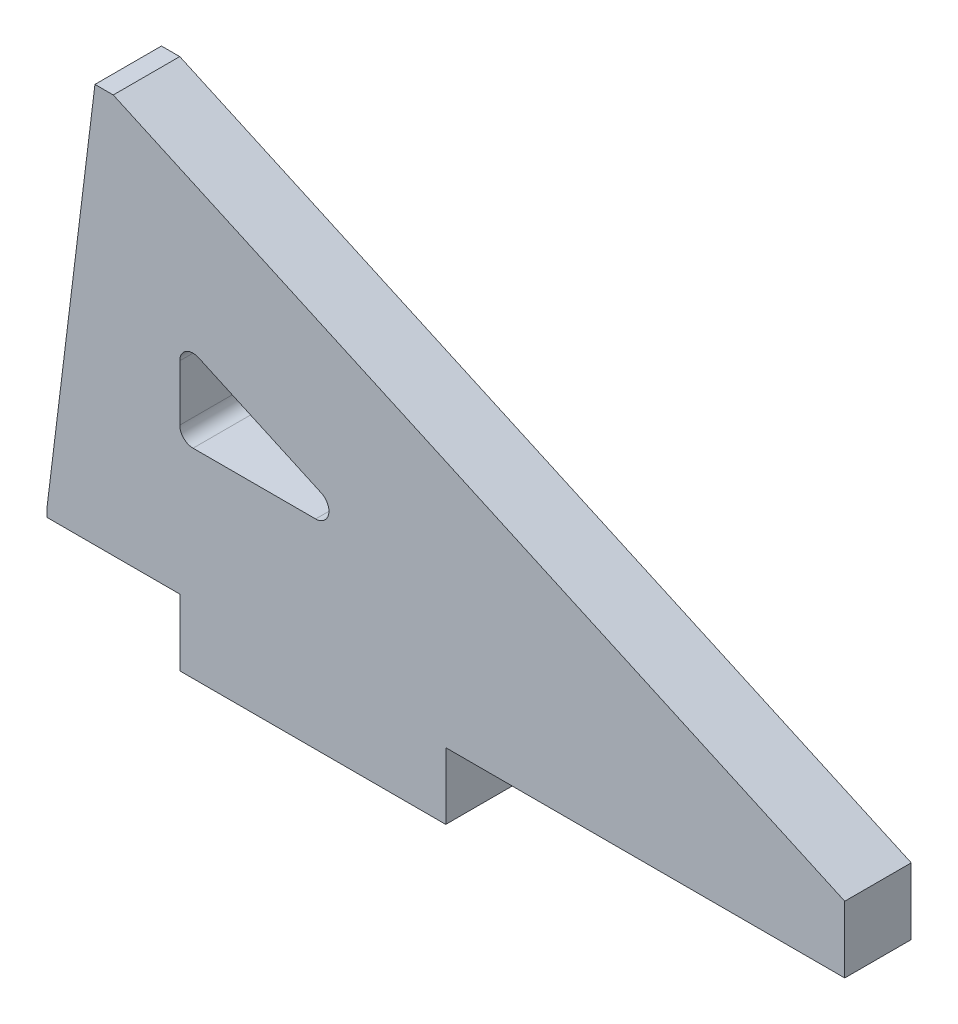
ISO-10303-21;
HEADER;
FILE_DESCRIPTION(('STEP AP214'),'2;1');
FILE_NAME('part.step','',(''),(''),'','','');
FILE_SCHEMA(('AUTOMOTIVE_DESIGN { 1 0 10303 214 1 1 1 1 }'));
ENDSEC;
DATA;
#1=APPLICATION_CONTEXT('core data for automotive mechanical design processes');
#2=APPLICATION_PROTOCOL_DEFINITION('international standard','automotive_design',2000,#1);
#3=PRODUCT_CONTEXT('',#1,'mechanical');
#4=PRODUCT('Part','Part','',(#3));
#5=PRODUCT_RELATED_PRODUCT_CATEGORY('part','',(#4));
#6=PRODUCT_DEFINITION_FORMATION('','',#4);
#7=PRODUCT_DEFINITION_CONTEXT('part definition',#1,'design');
#8=PRODUCT_DEFINITION('design','',#6,#7);
#9=PRODUCT_DEFINITION_SHAPE('','',#8);
#10=(LENGTH_UNIT() NAMED_UNIT(*) SI_UNIT(.MILLI.,.METRE.));
#11=(NAMED_UNIT(*) PLANE_ANGLE_UNIT() SI_UNIT($,.RADIAN.));
#12=(NAMED_UNIT(*) SI_UNIT($,.STERADIAN.) SOLID_ANGLE_UNIT());
#13=UNCERTAINTY_MEASURE_WITH_UNIT(LENGTH_MEASURE(1.E-05),#10,'distance_accuracy_value','');
#14=(GEOMETRIC_REPRESENTATION_CONTEXT(3) GLOBAL_UNCERTAINTY_ASSIGNED_CONTEXT((#13)) GLOBAL_UNIT_ASSIGNED_CONTEXT((#10,
#11,#12)) REPRESENTATION_CONTEXT('',''));
#15=CARTESIAN_POINT('',(0.,0.,0.));
#16=DIRECTION('',(0.,0.,1.));
#17=DIRECTION('',(1.,0.,0.));
#18=AXIS2_PLACEMENT_3D('',#15,#16,#17);
#19=CARTESIAN_POINT('',(0.,0.,6.35));
#20=DIRECTION('',(0.,0.,-1.));
#21=DIRECTION('',(-1.,0.,0.));
#22=AXIS2_PLACEMENT_3D('',#19,#20,#21);
#23=PLANE('',#22);
#24=DIRECTION('',(-1.,0.,0.));
#25=VECTOR('',#24,1.);
#26=CARTESIAN_POINT('',(-12.7,44.45,6.35));
#27=LINE('',#26,#25);
#28=CARTESIAN_POINT('',(-6.35,44.45,6.35));
#29=VERTEX_POINT('',#28);
#30=CARTESIAN_POINT('',(-8.09810822959274,44.45,6.35));
#31=VERTEX_POINT('',#30);
#32=EDGE_CURVE('E228',#29,#31,#27,.T.);
#33=ORIENTED_EDGE('',*,*,#32,.T.);
#34=DIRECTION('',(0.121869343405138,0.992546151641323,0.));
#35=VECTOR('',#34,1.);
#36=CARTESIAN_POINT('',(-8.09810822959274,44.45,6.35));
#37=LINE('',#36,#35);
#38=CARTESIAN_POINT('',(-12.7,6.97059919775531,6.35));
#39=VERTEX_POINT('',#38);
#40=EDGE_CURVE('E153',#39,#31,#37,.T.);
#41=ORIENTED_EDGE('',*,*,#40,.F.);
#42=DIRECTION('',(0.,-1.,0.));
#43=VECTOR('',#42,1.);
#44=CARTESIAN_POINT('',(-12.7,6.34999999999999,6.35));
#45=LINE('',#44,#43);
#46=CARTESIAN_POINT('',(-12.7,6.34999999999999,6.35));
#47=VERTEX_POINT('',#46);
#48=EDGE_CURVE('E226',#39,#47,#45,.T.);
#49=ORIENTED_EDGE('',*,*,#48,.T.);
#50=DIRECTION('',(1.,0.,0.));
#51=VECTOR('',#50,1.);
#52=CARTESIAN_POINT('',(0.,6.35,6.35));
#53=LINE('',#52,#51);
#54=CARTESIAN_POINT('',(0.,6.35,6.35));
#55=VERTEX_POINT('',#54);
#56=EDGE_CURVE('E224',#47,#55,#53,.T.);
#57=ORIENTED_EDGE('',*,*,#56,.T.);
#58=DIRECTION('',(0.,-1.,0.));
#59=VECTOR('',#58,1.);
#60=CARTESIAN_POINT('',(0.,0.,6.35));
#61=LINE('',#60,#59);
#62=CARTESIAN_POINT('',(0.,0.,6.35));
#63=VERTEX_POINT('',#62);
#64=EDGE_CURVE('E191',#55,#63,#61,.T.);
#65=ORIENTED_EDGE('',*,*,#64,.T.);
#66=DIRECTION('',(1.,0.,0.));
#67=VECTOR('',#66,1.);
#68=CARTESIAN_POINT('',(25.4,0.,6.35));
#69=LINE('',#68,#67);
#70=CARTESIAN_POINT('',(25.4,0.,6.35));
#71=VERTEX_POINT('',#70);
#72=EDGE_CURVE('E186',#63,#71,#69,.T.);
#73=ORIENTED_EDGE('',*,*,#72,.T.);
#74=DIRECTION('',(0.,1.,0.));
#75=VECTOR('',#74,1.);
#76=CARTESIAN_POINT('',(25.4,6.35,6.35));
#77=LINE('',#76,#75);
#78=CARTESIAN_POINT('',(25.4,6.35,6.35));
#79=VERTEX_POINT('',#78);
#80=EDGE_CURVE('E235',#71,#79,#77,.T.);
#81=ORIENTED_EDGE('',*,*,#80,.T.);
#82=DIRECTION('',(1.,0.,0.));
#83=VECTOR('',#82,1.);
#84=CARTESIAN_POINT('',(63.5,6.35,6.35));
#85=LINE('',#84,#83);
#86=CARTESIAN_POINT('',(63.5,6.35,6.35));
#87=VERTEX_POINT('',#86);
#88=EDGE_CURVE('E211',#79,#87,#85,.T.);
#89=ORIENTED_EDGE('',*,*,#88,.T.);
#90=DIRECTION('',(0.,1.,0.));
#91=VECTOR('',#90,1.);
#92=CARTESIAN_POINT('',(63.5,12.7,6.35));
#93=LINE('',#92,#91);
#94=CARTESIAN_POINT('',(63.5,12.7,6.35));
#95=VERTEX_POINT('',#94);
#96=EDGE_CURVE('E232',#87,#95,#93,.T.);
#97=ORIENTED_EDGE('',*,*,#96,.T.);
#98=DIRECTION('',(-0.910366477462605,0.413802944301184,0.));
#99=VECTOR('',#98,1.);
#100=CARTESIAN_POINT('',(-6.35,44.45,6.35));
#101=LINE('',#100,#99);
#102=EDGE_CURVE('E230',#95,#29,#101,.T.);
#103=ORIENTED_EDGE('',*,*,#102,.T.);
#104=EDGE_LOOP('',(#33,#41,#49,#57,#65,#73,#81,#89,#97,#103));
#105=FACE_BOUND('',#104,.T.);
#106=CARTESIAN_POINT('',(1.27,20.32,6.35));
#107=DIRECTION('',(0.,0.,1.));
#108=DIRECTION('',(1.,0.,0.));
#109=AXIS2_PLACEMENT_3D('',#106,#107,#108);
#110=CIRCLE('',#109,1.27);
#111=CARTESIAN_POINT('',(0.,20.32,6.35));
#112=VERTEX_POINT('',#111);
#113=CARTESIAN_POINT('',(1.27000000000001,19.05,6.35));
#114=VERTEX_POINT('',#113);
#115=EDGE_CURVE('E255',#112,#114,#110,.T.);
#116=ORIENTED_EDGE('',*,*,#115,.F.);
#117=DIRECTION('',(0.,-1.,0.));
#118=VECTOR('',#117,1.);
#119=CARTESIAN_POINT('',(0.,25.6408952498985,6.35));
#120=LINE('',#119,#118);
#121=CARTESIAN_POINT('',(0.,25.6408952498985,6.35));
#122=VERTEX_POINT('',#121);
#123=EDGE_CURVE('E251',#122,#112,#120,.T.);
#124=ORIENTED_EDGE('',*,*,#123,.F.);
#125=CARTESIAN_POINT('',(1.27,25.6408952498985,6.35));
#126=DIRECTION('',(0.,0.,1.));
#127=DIRECTION('',(1.,0.,0.));
#128=AXIS2_PLACEMENT_3D('',#125,#126,#127);
#129=CIRCLE('',#128,1.27);
#130=CARTESIAN_POINT('',(1.79552973926252,26.797060676276,6.35));
#131=VERTEX_POINT('',#130);
#132=EDGE_CURVE('E271',#131,#122,#129,.T.);
#133=ORIENTED_EDGE('',*,*,#132,.F.);
#134=DIRECTION('',(-0.910366477462605,0.413802944301184,0.));
#135=VECTOR('',#134,1.);
#136=CARTESIAN_POINT('',(13.5014992890392,21.4761654263775,6.35));
#137=LINE('',#136,#135);
#138=CARTESIAN_POINT('',(13.5014992890392,21.4761654263775,6.35));
#139=VERTEX_POINT('',#138);
#140=EDGE_CURVE('E273',#139,#131,#137,.T.);
#141=ORIENTED_EDGE('',*,*,#140,.F.);
#142=CARTESIAN_POINT('',(12.9759695497768,20.32,6.35));
#143=DIRECTION('',(0.,0.,1.));
#144=DIRECTION('',(1.,0.,0.));
#145=AXIS2_PLACEMENT_3D('',#142,#143,#144);
#146=CIRCLE('',#145,1.27);
#147=CARTESIAN_POINT('',(12.9759695497767,19.05,6.35));
#148=VERTEX_POINT('',#147);
#149=EDGE_CURVE('E275',#148,#139,#146,.T.);
#150=ORIENTED_EDGE('',*,*,#149,.F.);
#151=DIRECTION('',(1.,0.,0.));
#152=VECTOR('',#151,1.);
#153=CARTESIAN_POINT('',(1.27000000000001,19.05,6.35));
#154=LINE('',#153,#152);
#155=EDGE_CURVE('E277',#114,#148,#154,.T.);
#156=ORIENTED_EDGE('',*,*,#155,.F.);
#157=EDGE_LOOP('',(#116,#124,#133,#141,#150,#156));
#158=FACE_BOUND('',#157,.T.);
#159=ADVANCED_FACE('F39',(#105,#158),#23,.F.);
#160=CARTESIAN_POINT('',(0.,0.,0.));
#161=DIRECTION('',(0.,0.,-1.));
#162=DIRECTION('',(-1.,0.,0.));
#163=AXIS2_PLACEMENT_3D('',#160,#161,#162);
#164=PLANE('',#163);
#165=DIRECTION('',(0.121869343405138,0.992546151641323,0.));
#166=VECTOR('',#165,1.);
#167=CARTESIAN_POINT('',(-8.09810822959274,44.45,0.));
#168=LINE('',#167,#166);
#169=CARTESIAN_POINT('',(-12.7,6.97059919775531,0.));
#170=VERTEX_POINT('',#169);
#171=CARTESIAN_POINT('',(-8.09810822959274,44.45,0.));
#172=VERTEX_POINT('',#171);
#173=EDGE_CURVE('E54',#170,#172,#168,.T.);
#174=ORIENTED_EDGE('',*,*,#173,.T.);
#175=DIRECTION('',(-1.,0.,0.));
#176=VECTOR('',#175,1.);
#177=CARTESIAN_POINT('',(-12.7,44.45,0.));
#178=LINE('',#177,#176);
#179=CARTESIAN_POINT('',(-6.35,44.45,0.));
#180=VERTEX_POINT('',#179);
#181=EDGE_CURVE('E167',#180,#172,#178,.T.);
#182=ORIENTED_EDGE('',*,*,#181,.F.);
#183=DIRECTION('',(-0.910366477462605,0.413802944301184,0.));
#184=VECTOR('',#183,1.);
#185=CARTESIAN_POINT('',(-6.35,44.45,0.));
#186=LINE('',#185,#184);
#187=CARTESIAN_POINT('',(63.5,12.7,0.));
#188=VERTEX_POINT('',#187);
#189=EDGE_CURVE('E175',#188,#180,#186,.T.);
#190=ORIENTED_EDGE('',*,*,#189,.F.);
#191=DIRECTION('',(0.,1.,0.));
#192=VECTOR('',#191,1.);
#193=CARTESIAN_POINT('',(63.5,12.7,0.));
#194=LINE('',#193,#192);
#195=CARTESIAN_POINT('',(63.5,6.35,0.));
#196=VERTEX_POINT('',#195);
#197=EDGE_CURVE('E179',#196,#188,#194,.T.);
#198=ORIENTED_EDGE('',*,*,#197,.F.);
#199=DIRECTION('',(1.,0.,0.));
#200=VECTOR('',#199,1.);
#201=CARTESIAN_POINT('',(63.5,6.35,0.));
#202=LINE('',#201,#200);
#203=CARTESIAN_POINT('',(25.4,6.35,0.));
#204=VERTEX_POINT('',#203);
#205=EDGE_CURVE('E210',#204,#196,#202,.T.);
#206=ORIENTED_EDGE('',*,*,#205,.F.);
#207=DIRECTION('',(0.,1.,0.));
#208=VECTOR('',#207,1.);
#209=CARTESIAN_POINT('',(25.4,6.35,0.));
#210=LINE('',#209,#208);
#211=CARTESIAN_POINT('',(25.4,0.,0.));
#212=VERTEX_POINT('',#211);
#213=EDGE_CURVE('E215',#212,#204,#210,.T.);
#214=ORIENTED_EDGE('',*,*,#213,.F.);
#215=DIRECTION('',(1.,0.,0.));
#216=VECTOR('',#215,1.);
#217=CARTESIAN_POINT('',(25.4,0.,0.));
#218=LINE('',#217,#216);
#219=CARTESIAN_POINT('',(0.,0.,0.));
#220=VERTEX_POINT('',#219);
#221=EDGE_CURVE('E217',#220,#212,#218,.T.);
#222=ORIENTED_EDGE('',*,*,#221,.F.);
#223=DIRECTION('',(0.,-1.,0.));
#224=VECTOR('',#223,1.);
#225=CARTESIAN_POINT('',(0.,0.,0.));
#226=LINE('',#225,#224);
#227=CARTESIAN_POINT('',(0.,6.35,0.));
#228=VERTEX_POINT('',#227);
#229=EDGE_CURVE('E184',#228,#220,#226,.T.);
#230=ORIENTED_EDGE('',*,*,#229,.F.);
#231=DIRECTION('',(1.,0.,0.));
#232=VECTOR('',#231,1.);
#233=CARTESIAN_POINT('',(0.,6.35,0.));
#234=LINE('',#233,#232);
#235=CARTESIAN_POINT('',(-12.7,6.34999999999999,0.));
#236=VERTEX_POINT('',#235);
#237=EDGE_CURVE('E177',#236,#228,#234,.T.);
#238=ORIENTED_EDGE('',*,*,#237,.F.);
#239=DIRECTION('',(0.,-1.,0.));
#240=VECTOR('',#239,1.);
#241=CARTESIAN_POINT('',(-12.7,6.34999999999999,0.));
#242=LINE('',#241,#240);
#243=EDGE_CURVE('E169',#170,#236,#242,.T.);
#244=ORIENTED_EDGE('',*,*,#243,.F.);
#245=EDGE_LOOP('',(#174,#182,#190,#198,#206,#214,#222,#230,#238,#244));
#246=FACE_BOUND('',#245,.T.);
#247=DIRECTION('',(0.,-1.,0.));
#248=VECTOR('',#247,1.);
#249=CARTESIAN_POINT('',(0.,25.6408952498985,0.));
#250=LINE('',#249,#248);
#251=CARTESIAN_POINT('',(0.,25.6408952498985,0.));
#252=VERTEX_POINT('',#251);
#253=CARTESIAN_POINT('',(0.,20.32,0.));
#254=VERTEX_POINT('',#253);
#255=EDGE_CURVE('E252',#252,#254,#250,.T.);
#256=ORIENTED_EDGE('',*,*,#255,.T.);
#257=CARTESIAN_POINT('',(1.27,20.32,0.));
#258=DIRECTION('',(0.,0.,1.));
#259=DIRECTION('',(1.,0.,0.));
#260=AXIS2_PLACEMENT_3D('',#257,#258,#259);
#261=CIRCLE('',#260,1.27);
#262=CARTESIAN_POINT('',(1.27000000000001,19.05,0.));
#263=VERTEX_POINT('',#262);
#264=EDGE_CURVE('E158',#254,#263,#261,.T.);
#265=ORIENTED_EDGE('',*,*,#264,.T.);
#266=DIRECTION('',(1.,0.,0.));
#267=VECTOR('',#266,1.);
#268=CARTESIAN_POINT('',(1.27000000000001,19.05,0.));
#269=LINE('',#268,#267);
#270=CARTESIAN_POINT('',(12.9759695497767,19.05,0.));
#271=VERTEX_POINT('',#270);
#272=EDGE_CURVE('E265',#263,#271,#269,.T.);
#273=ORIENTED_EDGE('',*,*,#272,.T.);
#274=CARTESIAN_POINT('',(12.9759695497768,20.32,0.));
#275=DIRECTION('',(0.,0.,1.));
#276=DIRECTION('',(1.,0.,0.));
#277=AXIS2_PLACEMENT_3D('',#274,#275,#276);
#278=CIRCLE('',#277,1.27);
#279=CARTESIAN_POINT('',(13.5014992890392,21.4761654263775,0.));
#280=VERTEX_POINT('',#279);
#281=EDGE_CURVE('E262',#271,#280,#278,.T.);
#282=ORIENTED_EDGE('',*,*,#281,.T.);
#283=DIRECTION('',(-0.910366477462605,0.413802944301184,0.));
#284=VECTOR('',#283,1.);
#285=CARTESIAN_POINT('',(13.5014992890392,21.4761654263775,0.));
#286=LINE('',#285,#284);
#287=CARTESIAN_POINT('',(1.79552973926252,26.797060676276,0.));
#288=VERTEX_POINT('',#287);
#289=EDGE_CURVE('E259',#280,#288,#286,.T.);
#290=ORIENTED_EDGE('',*,*,#289,.T.);
#291=CARTESIAN_POINT('',(1.27,25.6408952498985,0.));
#292=DIRECTION('',(0.,0.,1.));
#293=DIRECTION('',(1.,0.,0.));
#294=AXIS2_PLACEMENT_3D('',#291,#292,#293);
#295=CIRCLE('',#294,1.27);
#296=EDGE_CURVE('E256',#288,#252,#295,.T.);
#297=ORIENTED_EDGE('',*,*,#296,.T.);
#298=EDGE_LOOP('',(#256,#265,#273,#282,#290,#297));
#299=FACE_BOUND('',#298,.T.);
#300=ADVANCED_FACE('F164',(#246,#299),#164,.T.);
#301=CARTESIAN_POINT('',(25.4,0.,6.35));
#302=DIRECTION('',(0.,1.,0.));
#303=DIRECTION('',(-1.,0.,0.));
#304=AXIS2_PLACEMENT_3D('',#301,#302,#303);
#305=PLANE('',#304);
#306=ORIENTED_EDGE('',*,*,#221,.T.);
#307=DIRECTION('',(0.,0.,-1.));
#308=VECTOR('',#307,1.);
#309=CARTESIAN_POINT('',(25.4,0.,6.35));
#310=LINE('',#309,#308);
#311=EDGE_CURVE('E11',#71,#212,#310,.T.);
#312=ORIENTED_EDGE('',*,*,#311,.F.);
#313=ORIENTED_EDGE('',*,*,#72,.F.);
#314=DIRECTION('',(0.,0.,-1.));
#315=VECTOR('',#314,1.);
#316=CARTESIAN_POINT('',(0.,0.,6.35));
#317=LINE('',#316,#315);
#318=EDGE_CURVE('E187',#63,#220,#317,.T.);
#319=ORIENTED_EDGE('',*,*,#318,.T.);
#320=EDGE_LOOP('',(#306,#312,#313,#319));
#321=FACE_BOUND('',#320,.T.);
#322=ADVANCED_FACE('F41',(#321),#305,.F.);
#323=CARTESIAN_POINT('',(25.4,6.35,6.35));
#324=DIRECTION('',(-1.,0.,0.));
#325=DIRECTION('',(0.,0.,1.));
#326=AXIS2_PLACEMENT_3D('',#323,#324,#325);
#327=PLANE('',#326);
#328=ORIENTED_EDGE('',*,*,#213,.T.);
#329=DIRECTION('',(0.,0.,-1.));
#330=VECTOR('',#329,1.);
#331=CARTESIAN_POINT('',(25.4,6.35,6.35));
#332=LINE('',#331,#330);
#333=EDGE_CURVE('E47',#79,#204,#332,.T.);
#334=ORIENTED_EDGE('',*,*,#333,.F.);
#335=ORIENTED_EDGE('',*,*,#80,.F.);
#336=ORIENTED_EDGE('',*,*,#311,.T.);
#337=EDGE_LOOP('',(#328,#334,#335,#336));
#338=FACE_BOUND('',#337,.T.);
#339=ADVANCED_FACE('F299',(#338),#327,.F.);
#340=CARTESIAN_POINT('',(63.5,6.35,6.35));
#341=DIRECTION('',(0.,1.,0.));
#342=DIRECTION('',(-1.,0.,0.));
#343=AXIS2_PLACEMENT_3D('',#340,#341,#342);
#344=PLANE('',#343);
#345=ORIENTED_EDGE('',*,*,#205,.T.);
#346=DIRECTION('',(0.,0.,-1.));
#347=VECTOR('',#346,1.);
#348=CARTESIAN_POINT('',(63.5,6.35,6.35));
#349=LINE('',#348,#347);
#350=EDGE_CURVE('E201',#87,#196,#349,.T.);
#351=ORIENTED_EDGE('',*,*,#350,.F.);
#352=ORIENTED_EDGE('',*,*,#88,.F.);
#353=ORIENTED_EDGE('',*,*,#333,.T.);
#354=EDGE_LOOP('',(#345,#351,#352,#353));
#355=FACE_BOUND('',#354,.T.);
#356=ADVANCED_FACE('F208',(#355),#344,.F.);
#357=CARTESIAN_POINT('',(63.5,12.7,6.35));
#358=DIRECTION('',(-1.,0.,0.));
#359=DIRECTION('',(0.,0.,1.));
#360=AXIS2_PLACEMENT_3D('',#357,#358,#359);
#361=PLANE('',#360);
#362=ORIENTED_EDGE('',*,*,#197,.T.);
#363=DIRECTION('',(0.,0.,-1.));
#364=VECTOR('',#363,1.);
#365=CARTESIAN_POINT('',(63.5,12.7,6.35));
#366=LINE('',#365,#364);
#367=EDGE_CURVE('E198',#95,#188,#366,.T.);
#368=ORIENTED_EDGE('',*,*,#367,.F.);
#369=ORIENTED_EDGE('',*,*,#96,.F.);
#370=ORIENTED_EDGE('',*,*,#350,.T.);
#371=EDGE_LOOP('',(#362,#368,#369,#370));
#372=FACE_BOUND('',#371,.T.);
#373=ADVANCED_FACE('F303',(#372),#361,.F.);
#374=CARTESIAN_POINT('',(-6.35,44.45,6.35));
#375=DIRECTION('',(-0.413802944301184,-0.910366477462605,0.));
#376=DIRECTION('',(0.910366477462605,-0.413802944301184,0.));
#377=AXIS2_PLACEMENT_3D('',#374,#375,#376);
#378=PLANE('',#377);
#379=ORIENTED_EDGE('',*,*,#189,.T.);
#380=DIRECTION('',(0.,0.,-1.));
#381=VECTOR('',#380,1.);
#382=CARTESIAN_POINT('',(-6.35,44.45,6.35));
#383=LINE('',#382,#381);
#384=EDGE_CURVE('E174',#29,#180,#383,.T.);
#385=ORIENTED_EDGE('',*,*,#384,.F.);
#386=ORIENTED_EDGE('',*,*,#102,.F.);
#387=ORIENTED_EDGE('',*,*,#367,.T.);
#388=EDGE_LOOP('',(#379,#385,#386,#387));
#389=FACE_BOUND('',#388,.T.);
#390=ADVANCED_FACE('F306',(#389),#378,.F.);
#391=CARTESIAN_POINT('',(-12.7,44.45,6.35));
#392=DIRECTION('',(0.,-1.,0.));
#393=DIRECTION('',(0.,0.,-1.));
#394=AXIS2_PLACEMENT_3D('',#391,#392,#393);
#395=PLANE('',#394);
#396=ORIENTED_EDGE('',*,*,#181,.T.);
#397=DIRECTION('',(0.,0.,1.));
#398=VECTOR('',#397,1.);
#399=CARTESIAN_POINT('',(-8.09810822959274,44.45,0.));
#400=LINE('',#399,#398);
#401=EDGE_CURVE('E150',#172,#31,#400,.T.);
#402=ORIENTED_EDGE('',*,*,#401,.T.);
#403=ORIENTED_EDGE('',*,*,#32,.F.);
#404=ORIENTED_EDGE('',*,*,#384,.T.);
#405=EDGE_LOOP('',(#396,#402,#403,#404));
#406=FACE_BOUND('',#405,.T.);
#407=ADVANCED_FACE('F172',(#406),#395,.F.);
#408=CARTESIAN_POINT('',(-12.7,6.34999999999999,6.35));
#409=DIRECTION('',(1.,0.,0.));
#410=DIRECTION('',(0.,0.,-1.));
#411=AXIS2_PLACEMENT_3D('',#408,#409,#410);
#412=PLANE('',#411);
#413=ORIENTED_EDGE('',*,*,#48,.F.);
#414=DIRECTION('',(0.,0.,1.));
#415=VECTOR('',#414,1.);
#416=CARTESIAN_POINT('',(-12.7,6.97059919775531,0.));
#417=LINE('',#416,#415);
#418=EDGE_CURVE('E159',#170,#39,#417,.T.);
#419=ORIENTED_EDGE('',*,*,#418,.F.);
#420=ORIENTED_EDGE('',*,*,#243,.T.);
#421=DIRECTION('',(0.,0.,-1.));
#422=VECTOR('',#421,1.);
#423=CARTESIAN_POINT('',(-12.7,6.34999999999999,6.35));
#424=LINE('',#423,#422);
#425=EDGE_CURVE('E194',#47,#236,#424,.T.);
#426=ORIENTED_EDGE('',*,*,#425,.F.);
#427=EDGE_LOOP('',(#413,#419,#420,#426));
#428=FACE_BOUND('',#427,.T.);
#429=ADVANCED_FACE('F286',(#428),#412,.F.);
#430=CARTESIAN_POINT('',(0.,6.35,6.35));
#431=DIRECTION('',(0.,1.,0.));
#432=DIRECTION('',(-1.,0.,0.));
#433=AXIS2_PLACEMENT_3D('',#430,#431,#432);
#434=PLANE('',#433);
#435=ORIENTED_EDGE('',*,*,#237,.T.);
#436=DIRECTION('',(0.,0.,-1.));
#437=VECTOR('',#436,1.);
#438=CARTESIAN_POINT('',(0.,6.35,6.35));
#439=LINE('',#438,#437);
#440=EDGE_CURVE('E190',#55,#228,#439,.T.);
#441=ORIENTED_EDGE('',*,*,#440,.F.);
#442=ORIENTED_EDGE('',*,*,#56,.F.);
#443=ORIENTED_EDGE('',*,*,#425,.T.);
#444=EDGE_LOOP('',(#435,#441,#442,#443));
#445=FACE_BOUND('',#444,.T.);
#446=ADVANCED_FACE('F290',(#445),#434,.F.);
#447=CARTESIAN_POINT('',(0.,0.,6.35));
#448=DIRECTION('',(1.,0.,0.));
#449=DIRECTION('',(0.,0.,-1.));
#450=AXIS2_PLACEMENT_3D('',#447,#448,#449);
#451=PLANE('',#450);
#452=ORIENTED_EDGE('',*,*,#229,.T.);
#453=ORIENTED_EDGE('',*,*,#318,.F.);
#454=ORIENTED_EDGE('',*,*,#64,.F.);
#455=ORIENTED_EDGE('',*,*,#440,.T.);
#456=EDGE_LOOP('',(#452,#453,#454,#455));
#457=FACE_BOUND('',#456,.T.);
#458=ADVANCED_FACE('F296',(#457),#451,.F.);
#459=CARTESIAN_POINT('',(1.27,20.32,6.35));
#460=DIRECTION('',(0.,0.,-1.));
#461=DIRECTION('',(-1.,0.,0.));
#462=AXIS2_PLACEMENT_3D('',#459,#460,#461);
#463=CYLINDRICAL_SURFACE('',#462,1.27);
#464=ORIENTED_EDGE('',*,*,#264,.F.);
#465=DIRECTION('',(0.,0.,-1.));
#466=VECTOR('',#465,1.);
#467=CARTESIAN_POINT('',(0.,20.32,6.35));
#468=LINE('',#467,#466);
#469=EDGE_CURVE('E248',#112,#254,#468,.T.);
#470=ORIENTED_EDGE('',*,*,#469,.F.);
#471=ORIENTED_EDGE('',*,*,#115,.T.);
#472=DIRECTION('',(0.,0.,-1.));
#473=VECTOR('',#472,1.);
#474=CARTESIAN_POINT('',(1.27000000000001,19.05,6.35));
#475=LINE('',#474,#473);
#476=EDGE_CURVE('E222',#114,#263,#475,.T.);
#477=ORIENTED_EDGE('',*,*,#476,.T.);
#478=EDGE_LOOP('',(#464,#470,#471,#477));
#479=FACE_BOUND('',#478,.T.);
#480=ADVANCED_FACE('F324',(#479),#463,.F.);
#481=CARTESIAN_POINT('',(1.27000000000001,19.05,6.35));
#482=DIRECTION('',(0.,1.,0.));
#483=DIRECTION('',(0.,0.,1.));
#484=AXIS2_PLACEMENT_3D('',#481,#482,#483);
#485=PLANE('',#484);
#486=ORIENTED_EDGE('',*,*,#272,.F.);
#487=ORIENTED_EDGE('',*,*,#476,.F.);
#488=ORIENTED_EDGE('',*,*,#155,.T.);
#489=DIRECTION('',(0.,0.,-1.));
#490=VECTOR('',#489,1.);
#491=CARTESIAN_POINT('',(12.9759695497767,19.05,6.35));
#492=LINE('',#491,#490);
#493=EDGE_CURVE('E241',#148,#271,#492,.T.);
#494=ORIENTED_EDGE('',*,*,#493,.T.);
#495=EDGE_LOOP('',(#486,#487,#488,#494));
#496=FACE_BOUND('',#495,.T.);
#497=ADVANCED_FACE('F382',(#496),#485,.T.);
#498=CARTESIAN_POINT('',(12.9759695497768,20.32,6.35));
#499=DIRECTION('',(0.,0.,-1.));
#500=DIRECTION('',(-1.,0.,0.));
#501=AXIS2_PLACEMENT_3D('',#498,#499,#500);
#502=CYLINDRICAL_SURFACE('',#501,1.27);
#503=ORIENTED_EDGE('',*,*,#281,.F.);
#504=ORIENTED_EDGE('',*,*,#493,.F.);
#505=ORIENTED_EDGE('',*,*,#149,.T.);
#506=DIRECTION('',(0.,0.,-1.));
#507=VECTOR('',#506,1.);
#508=CARTESIAN_POINT('',(13.5014992890392,21.4761654263775,6.35));
#509=LINE('',#508,#507);
#510=EDGE_CURVE('E243',#139,#280,#509,.T.);
#511=ORIENTED_EDGE('',*,*,#510,.T.);
#512=EDGE_LOOP('',(#503,#504,#505,#511));
#513=FACE_BOUND('',#512,.T.);
#514=ADVANCED_FACE('F372',(#513),#502,.F.);
#515=CARTESIAN_POINT('',(13.5014992890392,21.4761654263775,6.35));
#516=DIRECTION('',(-0.413802944301184,-0.910366477462605,0.));
#517=DIRECTION('',(0.910366477462605,-0.413802944301184,0.));
#518=AXIS2_PLACEMENT_3D('',#515,#516,#517);
#519=PLANE('',#518);
#520=ORIENTED_EDGE('',*,*,#289,.F.);
#521=ORIENTED_EDGE('',*,*,#510,.F.);
#522=ORIENTED_EDGE('',*,*,#140,.T.);
#523=DIRECTION('',(0.,0.,-1.));
#524=VECTOR('',#523,1.);
#525=CARTESIAN_POINT('',(1.79552973926252,26.797060676276,6.35));
#526=LINE('',#525,#524);
#527=EDGE_CURVE('E245',#131,#288,#526,.T.);
#528=ORIENTED_EDGE('',*,*,#527,.T.);
#529=EDGE_LOOP('',(#520,#521,#522,#528));
#530=FACE_BOUND('',#529,.T.);
#531=ADVANCED_FACE('F362',(#530),#519,.T.);
#532=CARTESIAN_POINT('',(1.27,25.6408952498985,6.35));
#533=DIRECTION('',(0.,0.,-1.));
#534=DIRECTION('',(-1.,0.,0.));
#535=AXIS2_PLACEMENT_3D('',#532,#533,#534);
#536=CYLINDRICAL_SURFACE('',#535,1.27);
#537=ORIENTED_EDGE('',*,*,#296,.F.);
#538=ORIENTED_EDGE('',*,*,#527,.F.);
#539=ORIENTED_EDGE('',*,*,#132,.T.);
#540=DIRECTION('',(0.,0.,-1.));
#541=VECTOR('',#540,1.);
#542=CARTESIAN_POINT('',(0.,25.6408952498985,6.35));
#543=LINE('',#542,#541);
#544=EDGE_CURVE('E62',#122,#252,#543,.T.);
#545=ORIENTED_EDGE('',*,*,#544,.T.);
#546=EDGE_LOOP('',(#537,#538,#539,#545));
#547=FACE_BOUND('',#546,.T.);
#548=ADVANCED_FACE('F353',(#547),#536,.F.);
#549=CARTESIAN_POINT('',(0.,25.6408952498985,6.35));
#550=DIRECTION('',(1.,0.,0.));
#551=DIRECTION('',(0.,1.,0.));
#552=AXIS2_PLACEMENT_3D('',#549,#550,#551);
#553=PLANE('',#552);
#554=ORIENTED_EDGE('',*,*,#255,.F.);
#555=ORIENTED_EDGE('',*,*,#544,.F.);
#556=ORIENTED_EDGE('',*,*,#123,.T.);
#557=ORIENTED_EDGE('',*,*,#469,.T.);
#558=EDGE_LOOP('',(#554,#555,#556,#557));
#559=FACE_BOUND('',#558,.T.);
#560=ADVANCED_FACE('F342',(#559),#553,.T.);
#561=CARTESIAN_POINT('',(-8.09810822959274,44.45,0.));
#562=DIRECTION('',(0.992546151641323,-0.121869343405138,0.));
#563=DIRECTION('',(0.121869343405138,0.992546151641323,0.));
#564=AXIS2_PLACEMENT_3D('',#561,#562,#563);
#565=PLANE('',#564);
#566=ORIENTED_EDGE('',*,*,#40,.T.);
#567=ORIENTED_EDGE('',*,*,#401,.F.);
#568=ORIENTED_EDGE('',*,*,#173,.F.);
#569=ORIENTED_EDGE('',*,*,#418,.T.);
#570=EDGE_LOOP('',(#566,#567,#568,#569));
#571=FACE_BOUND('',#570,.T.);
#572=ADVANCED_FACE('F151',(#571),#565,.F.);
#573=CLOSED_SHELL('',(#159,#300,#322,#339,#356,#373,#390,#407,#429,#446,#458,#480,#497,#514,
#531,#548,#560,#572));
#574=MANIFOLD_SOLID_BREP('B2',#573);
#575=ADVANCED_BREP_SHAPE_REPRESENTATION('',(#18,#574),#14);
#576=SHAPE_DEFINITION_REPRESENTATION(#9,#575);
ENDSEC;
END-ISO-10303-21;
